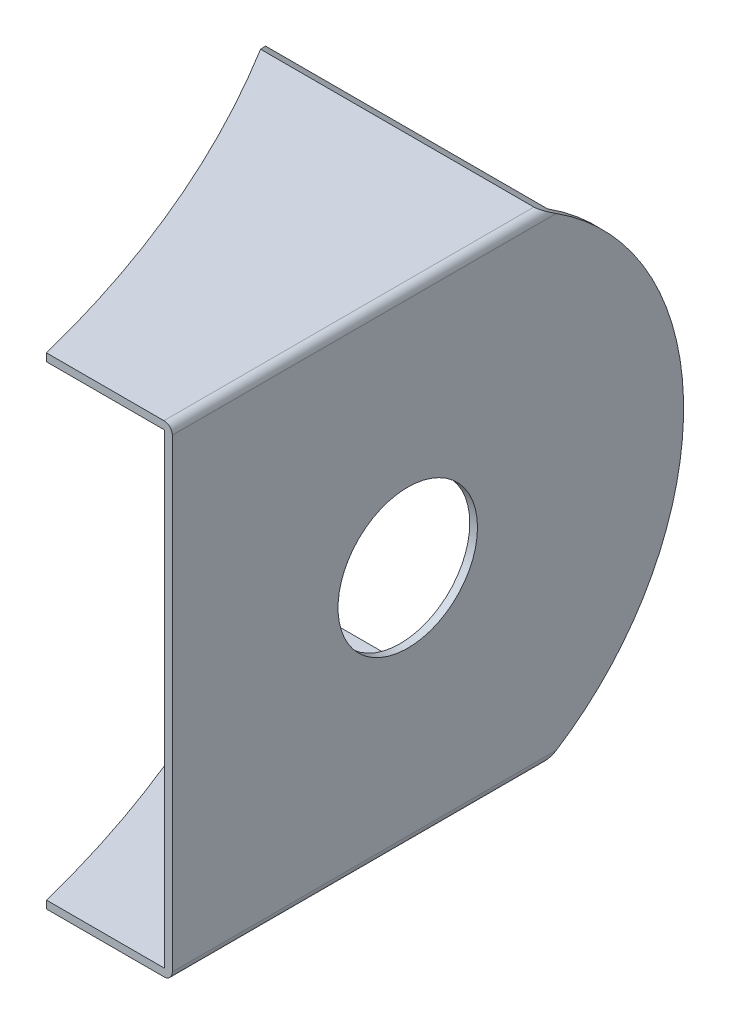
ISO-10303-21;
HEADER;
FILE_DESCRIPTION(('STEP AP214'),'2;1');
FILE_NAME('part.step','',(''),(''),'','','');
FILE_SCHEMA(('AUTOMOTIVE_DESIGN { 1 0 10303 214 1 1 1 1 }'));
ENDSEC;
DATA;
#1=APPLICATION_CONTEXT('core data for automotive mechanical design processes');
#2=APPLICATION_PROTOCOL_DEFINITION('international standard','automotive_design',2000,#1);
#3=PRODUCT_CONTEXT('',#1,'mechanical');
#4=PRODUCT('Part','Part','',(#3));
#5=PRODUCT_RELATED_PRODUCT_CATEGORY('part','',(#4));
#6=PRODUCT_DEFINITION_FORMATION('','',#4);
#7=PRODUCT_DEFINITION_CONTEXT('part definition',#1,'design');
#8=PRODUCT_DEFINITION('design','',#6,#7);
#9=PRODUCT_DEFINITION_SHAPE('','',#8);
#10=(LENGTH_UNIT() NAMED_UNIT(*) SI_UNIT(.MILLI.,.METRE.));
#11=(NAMED_UNIT(*) PLANE_ANGLE_UNIT() SI_UNIT($,.RADIAN.));
#12=(NAMED_UNIT(*) SI_UNIT($,.STERADIAN.) SOLID_ANGLE_UNIT());
#13=UNCERTAINTY_MEASURE_WITH_UNIT(LENGTH_MEASURE(1.E-05),#10,'distance_accuracy_value','');
#14=(GEOMETRIC_REPRESENTATION_CONTEXT(3) GLOBAL_UNCERTAINTY_ASSIGNED_CONTEXT((#13)) GLOBAL_UNIT_ASSIGNED_CONTEXT((#10,
#11,#12)) REPRESENTATION_CONTEXT('',''));
#15=CARTESIAN_POINT('',(0.,0.,0.));
#16=DIRECTION('',(0.,0.,1.));
#17=DIRECTION('',(1.,0.,0.));
#18=AXIS2_PLACEMENT_3D('',#15,#16,#17);
#19=CARTESIAN_POINT('',(-2.5,0.,0.));
#20=DIRECTION('',(-1.,0.,0.));
#21=DIRECTION('',(0.,0.,1.));
#22=AXIS2_PLACEMENT_3D('',#19,#20,#21);
#23=PLANE('',#22);
#24=CARTESIAN_POINT('',(-2.5,0.,-265.));
#25=DIRECTION('',(-1.,0.,0.));
#26=DIRECTION('',(0.,0.,1.));
#27=AXIS2_PLACEMENT_3D('',#24,#25,#26);
#28=CIRCLE('',#27,22.5);
#29=CARTESIAN_POINT('',(-2.5,0.,-242.5));
#30=VERTEX_POINT('',#29);
#31=EDGE_CURVE('E223',#30,#30,#28,.T.);
#32=ORIENTED_EDGE('',*,*,#31,.F.);
#33=EDGE_LOOP('',(#32));
#34=FACE_BOUND('',#33,.T.);
#35=CARTESIAN_POINT('',(-2.5,0.,-265.));
#36=DIRECTION('',(-1.,0.,0.));
#37=DIRECTION('',(0.,0.,1.));
#38=AXIS2_PLACEMENT_3D('',#35,#36,#37);
#39=CIRCLE('',#38,89.);
#40=CARTESIAN_POINT('',(-2.5,-75.,-312.916594202844));
#41=VERTEX_POINT('',#40);
#42=CARTESIAN_POINT('',(-2.49999999999999,75.,-312.916594202844));
#43=VERTEX_POINT('',#42);
#44=EDGE_CURVE('E295',#41,#43,#39,.F.);
#45=ORIENTED_EDGE('',*,*,#44,.F.);
#46=DIRECTION('',(0.,0.,-1.));
#47=VECTOR('',#46,1.);
#48=CARTESIAN_POINT('',(-2.5,-75.,365.));
#49=LINE('',#48,#47);
#50=CARTESIAN_POINT('',(-2.5,-75.,-189.039471801476));
#51=VERTEX_POINT('',#50);
#52=EDGE_CURVE('E176',#51,#41,#49,.T.);
#53=ORIENTED_EDGE('',*,*,#52,.F.);
#54=DIRECTION('',(0.,-1.,0.));
#55=VECTOR('',#54,1.);
#56=CARTESIAN_POINT('',(-2.5,0.,-189.039471801476));
#57=LINE('',#56,#55);
#58=CARTESIAN_POINT('',(-2.49999999999999,75.,-189.039471801476));
#59=VERTEX_POINT('',#58);
#60=EDGE_CURVE('E209',#59,#51,#57,.T.);
#61=ORIENTED_EDGE('',*,*,#60,.F.);
#62=DIRECTION('',(0.,0.,1.));
#63=VECTOR('',#62,1.);
#64=CARTESIAN_POINT('',(-2.5,75.,365.));
#65=LINE('',#64,#63);
#66=EDGE_CURVE('E237',#43,#59,#65,.T.);
#67=ORIENTED_EDGE('',*,*,#66,.F.);
#68=EDGE_LOOP('',(#45,#53,#61,#67));
#69=FACE_BOUND('',#68,.T.);
#70=ADVANCED_FACE('F78',(#34,#69),#23,.T.);
#71=CARTESIAN_POINT('',(0.,0.,0.));
#72=DIRECTION('',(-1.,0.,0.));
#73=DIRECTION('',(0.,0.,1.));
#74=AXIS2_PLACEMENT_3D('',#71,#72,#73);
#75=PLANE('',#74);
#76=CARTESIAN_POINT('',(0.,0.,-265.));
#77=DIRECTION('',(1.,0.,0.));
#78=DIRECTION('',(0.,0.,-1.));
#79=AXIS2_PLACEMENT_3D('',#76,#77,#78);
#80=CIRCLE('',#79,22.5);
#81=CARTESIAN_POINT('',(0.,0.,-287.5));
#82=VERTEX_POINT('',#81);
#83=EDGE_CURVE('E220',#82,#82,#80,.T.);
#84=ORIENTED_EDGE('',*,*,#83,.F.);
#85=EDGE_LOOP('',(#84));
#86=FACE_BOUND('',#85,.T.);
#87=DIRECTION('',(0.,0.,-1.));
#88=VECTOR('',#87,1.);
#89=CARTESIAN_POINT('',(0.,-75.,365.));
#90=LINE('',#89,#88);
#91=CARTESIAN_POINT('',(0.,-75.,-189.039471801476));
#92=VERTEX_POINT('',#91);
#93=CARTESIAN_POINT('',(0.,-75.,-312.916594202844));
#94=VERTEX_POINT('',#93);
#95=EDGE_CURVE('E239',#92,#94,#90,.T.);
#96=ORIENTED_EDGE('',*,*,#95,.T.);
#97=CARTESIAN_POINT('',(0.,0.,-265.));
#98=DIRECTION('',(-1.,0.,0.));
#99=DIRECTION('',(0.,0.,1.));
#100=AXIS2_PLACEMENT_3D('',#97,#98,#99);
#101=CIRCLE('',#100,89.);
#102=CARTESIAN_POINT('',(0.,75.,-312.916594202844));
#103=VERTEX_POINT('',#102);
#104=EDGE_CURVE('E292',#94,#103,#101,.F.);
#105=ORIENTED_EDGE('',*,*,#104,.T.);
#106=DIRECTION('',(0.,0.,1.));
#107=VECTOR('',#106,1.);
#108=CARTESIAN_POINT('',(0.,75.,365.));
#109=LINE('',#108,#107);
#110=CARTESIAN_POINT('',(0.,75.,-189.039471801476));
#111=VERTEX_POINT('',#110);
#112=EDGE_CURVE('E234',#103,#111,#109,.T.);
#113=ORIENTED_EDGE('',*,*,#112,.T.);
#114=DIRECTION('',(0.,-1.,0.));
#115=VECTOR('',#114,1.);
#116=CARTESIAN_POINT('',(0.,0.,-189.039471801476));
#117=LINE('',#116,#115);
#118=EDGE_CURVE('E206',#111,#92,#117,.T.);
#119=ORIENTED_EDGE('',*,*,#118,.T.);
#120=EDGE_LOOP('',(#96,#105,#113,#119));
#121=FACE_BOUND('',#120,.T.);
#122=ADVANCED_FACE('F80',(#86,#121),#75,.F.);
#123=CARTESIAN_POINT('',(-2.69999999999999,75.,-365.));
#124=DIRECTION('',(0.,0.,-1.));
#125=DIRECTION('',(0.,1.,0.));
#126=AXIS2_PLACEMENT_3D('',#123,#124,#125);
#127=CYLINDRICAL_SURFACE('',#126,2.70000000000001);
#128=CARTESIAN_POINT('',(-2.69999999999997,77.7,-308.401728076195));
#129=CARTESIAN_POINT('',(-2.65984174106867,77.7000054761132,-308.401717883849));
#130=CARTESIAN_POINT('',(-2.61970528145279,77.6991034412853,-308.403333172818));
#131=CARTESIAN_POINT('',(-2.53980520822541,77.6955387905893,-308.409714035789));
#132=CARTESIAN_POINT('',(-2.50004123564935,77.6928780963616,-308.414476171313));
#133=CARTESIAN_POINT('',(-2.38257877020893,77.6824174794397,-308.433192660789));
#134=CARTESIAN_POINT('',(-2.30577201693634,77.6721362371867,-308.451582221636));
#135=CARTESIAN_POINT('',(-2.13840998950567,77.6426315917734,-308.504285477607));
#136=CARTESIAN_POINT('',(-2.04902879567054,77.6218457699447,-308.541376779199));
#137=CARTESIAN_POINT('',(-1.87803547909732,77.5733886538341,-308.627649900219));
#138=CARTESIAN_POINT('',(-1.79646143216918,77.5456857783308,-308.676887161744));
#139=CARTESIAN_POINT('',(-1.59701187561457,77.4679108816823,-308.814746794419));
#140=CARTESIAN_POINT('',(-1.48508364540553,77.4141112449714,-308.9097812655));
#141=CARTESIAN_POINT('',(-1.27860490111387,77.298622782817,-309.112772265397));
#142=CARTESIAN_POINT('',(-1.18409022644408,77.2369181204061,-309.220754705645));
#143=CARTESIAN_POINT('',(-1.01593601718422,77.1128214081418,-309.436777347634));
#144=CARTESIAN_POINT('',(-0.941283618400156,77.0507984876956,-309.544253999978));
#145=CARTESIAN_POINT('',(-0.802703646058977,76.9233141028206,-309.764047137146));
#146=CARTESIAN_POINT('',(-0.738785133111477,76.8578497940605,-309.876367611201));
#147=CARTESIAN_POINT('',(-0.620156558505706,76.7240279015436,-310.104779546486));
#148=CARTESIAN_POINT('',(-0.565483953343053,76.6556598897692,-310.220884176106));
#149=CARTESIAN_POINT('',(-0.464656302995636,76.5167722720493,-310.455496572402));
#150=CARTESIAN_POINT('',(-0.418503814466663,76.4462520276506,-310.574005048607));
#151=CARTESIAN_POINT('',(-0.311470271773239,76.2653583754462,-310.87636130187));
#152=CARTESIAN_POINT('',(-0.255853419959808,76.153780447872,-311.061362462463));
#153=CARTESIAN_POINT('',(-0.161279447431643,75.9273334662262,-311.433690328185));
#154=CARTESIAN_POINT('',(-0.122333637112966,75.8124622340254,-311.621018523692));
#155=CARTESIAN_POINT('',(-0.0608930546610915,75.5822711688357,-311.99326839316));
#156=CARTESIAN_POINT('',(-0.0381096888427271,75.4669981949599,-312.178171199399));
#157=CARTESIAN_POINT('',(-0.0152806223880766,75.2927502461648,-312.455386101439));
#158=CARTESIAN_POINT('',(-0.00956196895024056,75.2344821123025,-312.547708999313));
#159=CARTESIAN_POINT('',(-0.00192392878167001,75.1175346055043,-312.732252529271));
#160=CARTESIAN_POINT('',(-4.57947227604466E-06,75.0588552285237,-312.82447316034));
#161=CARTESIAN_POINT('',(0.,75.,-312.916594202844));
#162=B_SPLINE_CURVE_WITH_KNOTS('',3,(#128,#129,#130,#131,#132,#133,#134,#135,#136,#137,#138,
#139,#140,#141,#142,#143,#144,#145,#146,#147,#148,#149,#150,#151,#152,#153,#154,#155,#156,#157,
#158,#159,#160,#161),.UNSPECIFIED.,.F.,.F.,(4,2,2,2,2,2,2,2,2,2,2,2,2,2,2,2,4),(0.,
0.120392027188317,0.240652722191142,0.478401767589207,0.773717648538598,1.07040733153267,
1.53691788742703,2.00437811250791,2.43819289647317,2.8723720481409,3.30827004349675,
3.74429862815162,4.41276982819331,5.08169383358021,5.73835060599414,6.0662608880654,
6.39417439988109),.UNSPECIFIED.);
#163=CARTESIAN_POINT('',(-2.69999999999998,77.7000000000004,-308.401728076195));
#164=VERTEX_POINT('',#163);
#165=EDGE_CURVE('E284',#164,#103,#162,.T.);
#166=ORIENTED_EDGE('',*,*,#165,.F.);
#167=DIRECTION('',(0.,0.,-1.));
#168=VECTOR('',#167,1.);
#169=CARTESIAN_POINT('',(-2.69999999999999,77.7,0.));
#170=LINE('',#169,#168);
#171=CARTESIAN_POINT('',(-2.69999999999997,77.7,-189.039471801476));
#172=VERTEX_POINT('',#171);
#173=EDGE_CURVE('E231',#172,#164,#170,.T.);
#174=ORIENTED_EDGE('',*,*,#173,.F.);
#175=CARTESIAN_POINT('',(-2.69999999999999,75.,-189.039471801476));
#176=DIRECTION('',(0.,0.,-1.));
#177=DIRECTION('',(-1.,0.,0.));
#178=AXIS2_PLACEMENT_3D('',#175,#176,#177);
#179=CIRCLE('',#178,2.70000000000001);
#180=EDGE_CURVE('E204',#111,#172,#179,.F.);
#181=ORIENTED_EDGE('',*,*,#180,.F.);
#182=ORIENTED_EDGE('',*,*,#112,.F.);
#183=EDGE_LOOP('',(#166,#174,#181,#182));
#184=FACE_BOUND('',#183,.T.);
#185=ADVANCED_FACE('F262',(#184),#127,.T.);
#186=CARTESIAN_POINT('',(-2.69999999999999,75.,-365.));
#187=DIRECTION('',(0.,0.,-1.));
#188=DIRECTION('',(0.,1.,0.));
#189=AXIS2_PLACEMENT_3D('',#186,#187,#188);
#190=CYLINDRICAL_SURFACE('',#189,0.200000000000006);
#191=DIRECTION('',(0.,0.,1.));
#192=VECTOR('',#191,1.);
#193=CARTESIAN_POINT('',(-2.70000000000001,75.2,365.));
#194=LINE('',#193,#192);
#195=CARTESIAN_POINT('',(-2.69999999999999,75.2,-189.039471801476));
#196=VERTEX_POINT('',#195);
#197=CARTESIAN_POINT('',(-2.70000000000001,75.2000000000004,-312.602100793977));
#198=VERTEX_POINT('',#197);
#199=EDGE_CURVE('E229',#196,#198,#194,.F.);
#200=ORIENTED_EDGE('',*,*,#199,.T.);
#201=CARTESIAN_POINT('',(-2.69999999999999,75.2,-312.602100793978));
#202=CARTESIAN_POINT('',(-2.69356074440797,75.2000081597546,-312.602087868224));
#203=CARTESIAN_POINT('',(-2.68714055642431,75.1996894485544,-312.602591392653));
#204=CARTESIAN_POINT('',(-2.67455867211747,75.1984726704153,-312.604513548254));
#205=CARTESIAN_POINT('',(-2.66839503066849,75.1975804389451,-312.605922962146));
#206=CARTESIAN_POINT('',(-2.65507803315628,75.1950333782778,-312.60994603715));
#207=CARTESIAN_POINT('',(-2.64800964799402,75.1932530330245,-312.61275788283));
#208=CARTESIAN_POINT('',(-2.63449025806675,75.1890998537107,-312.619316232223));
#209=CARTESIAN_POINT('',(-2.62804191392264,75.1867246113549,-312.623066534994));
#210=CARTESIAN_POINT('',(-2.61271343341617,75.180225706199,-312.633325679449));
#211=CARTESIAN_POINT('',(-2.60424696089279,75.1758243962924,-312.640271859968));
#212=CARTESIAN_POINT('',(-2.58865954876164,75.1663923286703,-312.65515232309));
#213=CARTESIAN_POINT('',(-2.58154112879144,75.1613604209051,-312.663088410904));
#214=CARTESIAN_POINT('',(-2.56358560665339,75.1469889522152,-312.685745663265));
#215=CARTESIAN_POINT('',(-2.55392106470705,75.1372293574547,-312.701122776083));
#216=CARTESIAN_POINT('',(-2.53729377265146,75.1170376674919,-312.732913295105));
#217=CARTESIAN_POINT('',(-2.53034477498696,75.1066024533928,-312.749331498938));
#218=CARTESIAN_POINT('',(-2.52025623972902,75.088155668948,-312.778332866958));
#219=CARTESIAN_POINT('',(-2.51659556886052,75.0802265551514,-312.790792020566));
#220=CARTESIAN_POINT('',(-2.51040050699822,75.0642313029192,-312.815911585961));
#221=CARTESIAN_POINT('',(-2.50786689376081,75.0561650738365,-312.828572130503));
#222=CARTESIAN_POINT('',(-2.50388851599764,75.040095804099,-312.853779797852));
#223=CARTESIAN_POINT('',(-2.50242523105904,75.0320941813387,-312.86632494786));
#224=CARTESIAN_POINT('',(-2.50048416425696,75.0160623709561,-312.891446095826));
#225=CARTESIAN_POINT('',(-2.50000485825316,75.00803224684,-312.904022015821));
#226=CARTESIAN_POINT('',(-2.49999999999999,75.,-312.916594202844));
#227=B_SPLINE_CURVE_WITH_KNOTS('',3,(#201,#202,#203,#204,#205,#206,#207,#208,#209,#210,#211,
#212,#213,#214,#215,#216,#217,#218,#219,#220,#221,#222,#223,#224,#225,#226),.UNSPECIFIED.,.F.,
.F.,(4,2,2,2,2,2,2,2,2,2,2,2,4),(0.,0.0192593530396677,0.0383257824187712,0.0616349667844509,
0.0850400825910045,0.120248878276495,0.155522846677881,0.217035299640851,0.278855356017721,
0.324455511713961,0.370087086392449,0.414909084578551,0.459661602905175),.UNSPECIFIED.);
#228=EDGE_CURVE('E276',#198,#43,#227,.T.);
#229=ORIENTED_EDGE('',*,*,#228,.T.);
#230=ORIENTED_EDGE('',*,*,#66,.T.);
#231=CARTESIAN_POINT('',(-2.69999999999999,75.,-189.039471801476));
#232=DIRECTION('',(0.,0.,-1.));
#233=DIRECTION('',(-1.,0.,0.));
#234=AXIS2_PLACEMENT_3D('',#231,#232,#233);
#235=CIRCLE('',#234,0.200000000000006);
#236=EDGE_CURVE('E201',#59,#196,#235,.F.);
#237=ORIENTED_EDGE('',*,*,#236,.T.);
#238=EDGE_LOOP('',(#200,#229,#230,#237));
#239=FACE_BOUND('',#238,.T.);
#240=ADVANCED_FACE('F267',(#239),#190,.F.);
#241=CARTESIAN_POINT('',(2.69957650317733E-13,77.7,0.));
#242=DIRECTION('',(0.,1.,0.));
#243=DIRECTION('',(-1.,0.,0.));
#244=AXIS2_PLACEMENT_3D('',#241,#242,#243);
#245=PLANE('',#244);
#246=CARTESIAN_POINT('',(-454.199150516691,77.7000000000004,-84.9999999999941));
#247=DIRECTION('',(0.,-1.,0.));
#248=DIRECTION('',(1.,0.,0.));
#249=AXIS2_PLACEMENT_3D('',#246,#247,#248);
#250=CIRCLE('',#249,426.5);
#251=CARTESIAN_POINT('',(-90.8894783462841,77.7000000000004,-308.401728076195));
#252=VERTEX_POINT('',#251);
#253=CARTESIAN_POINT('',(-40.5833404860915,77.7000000000018,-189.039471801476));
#254=VERTEX_POINT('',#253);
#255=EDGE_CURVE('E99',#252,#254,#250,.T.);
#256=ORIENTED_EDGE('',*,*,#255,.T.);
#257=DIRECTION('',(-1.,0.,0.));
#258=VECTOR('',#257,1.);
#259=CARTESIAN_POINT('',(2.69957650317733E-13,77.7,-189.039471801476));
#260=LINE('',#259,#258);
#261=EDGE_CURVE('E194',#172,#254,#260,.T.);
#262=ORIENTED_EDGE('',*,*,#261,.F.);
#263=ORIENTED_EDGE('',*,*,#173,.T.);
#264=DIRECTION('',(1.,0.,0.));
#265=VECTOR('',#264,1.);
#266=CARTESIAN_POINT('',(-130.,77.7000000000004,-308.401728076195));
#267=LINE('',#266,#265);
#268=EDGE_CURVE('E285',#252,#164,#267,.T.);
#269=ORIENTED_EDGE('',*,*,#268,.F.);
#270=EDGE_LOOP('',(#256,#262,#263,#269));
#271=FACE_BOUND('',#270,.T.);
#272=ADVANCED_FACE('F271',(#271),#245,.T.);
#273=CARTESIAN_POINT('',(2.61228946970625E-13,75.2,0.));
#274=DIRECTION('',(0.,1.,0.));
#275=DIRECTION('',(-1.,0.,0.));
#276=AXIS2_PLACEMENT_3D('',#273,#274,#275);
#277=PLANE('',#276);
#278=DIRECTION('',(-1.,0.,0.));
#279=VECTOR('',#278,1.);
#280=CARTESIAN_POINT('',(2.61228946970625E-13,75.2,-189.039471801476));
#281=LINE('',#280,#279);
#282=CARTESIAN_POINT('',(-40.5833404860915,75.2000000000001,-189.039471801476));
#283=VERTEX_POINT('',#282);
#284=EDGE_CURVE('E190',#196,#283,#281,.T.);
#285=ORIENTED_EDGE('',*,*,#284,.T.);
#286=CARTESIAN_POINT('',(-454.199150516691,75.2000000000016,-84.9999999999941));
#287=DIRECTION('',(0.,1.,0.));
#288=DIRECTION('',(-1.,0.,0.));
#289=AXIS2_PLACEMENT_3D('',#286,#287,#288);
#290=CIRCLE('',#289,426.5);
#291=CARTESIAN_POINT('',(-93.5060209533931,75.2000000000004,-312.602100793977));
#292=VERTEX_POINT('',#291);
#293=EDGE_CURVE('E328',#283,#292,#290,.T.);
#294=ORIENTED_EDGE('',*,*,#293,.T.);
#295=DIRECTION('',(1.,0.,0.));
#296=VECTOR('',#295,1.);
#297=CARTESIAN_POINT('',(-130.,75.2000000000004,-312.602100793977));
#298=LINE('',#297,#296);
#299=EDGE_CURVE('E349',#292,#198,#298,.T.);
#300=ORIENTED_EDGE('',*,*,#299,.T.);
#301=ORIENTED_EDGE('',*,*,#199,.F.);
#302=EDGE_LOOP('',(#285,#294,#300,#301));
#303=FACE_BOUND('',#302,.T.);
#304=ADVANCED_FACE('F318',(#303),#277,.F.);
#305=CARTESIAN_POINT('',(-2.70000000000002,-75.,365.));
#306=DIRECTION('',(0.,0.,1.));
#307=DIRECTION('',(0.,-1.,0.));
#308=AXIS2_PLACEMENT_3D('',#305,#306,#307);
#309=CYLINDRICAL_SURFACE('',#308,2.70000000000001);
#310=CARTESIAN_POINT('',(0.,-75.,-312.916594202844));
#311=CARTESIAN_POINT('',(-5.48315406733443E-06,-75.0615534313284,-312.820249925329));
#312=CARTESIAN_POINT('',(-0.00210431795436465,-75.122913952728,-312.723797557342));
#313=CARTESIAN_POINT('',(-0.0104562440630518,-75.2451842713042,-312.530782576569));
#314=CARTESIAN_POINT('',(-0.0167094666221996,-75.3060940541792,-312.434219960396));
#315=CARTESIAN_POINT('',(-0.0416787173237319,-75.488240162083,-312.144222668999));
#316=CARTESIAN_POINT('',(-0.0666041220879811,-75.6086938358383,-311.950790694987));
#317=CARTESIAN_POINT('',(-0.133105592482795,-75.8462911155908,-311.565986057194));
#318=CARTESIAN_POINT('',(-0.174607486245809,-75.9634470106966,-311.374608068388));
#319=CARTESIAN_POINT('',(-0.275186663854188,-76.1942049589935,-310.994482796744));
#320=CARTESIAN_POINT('',(-0.334247367463908,-76.307810253563,-310.805733207225));
#321=CARTESIAN_POINT('',(-0.430480944116539,-76.4635568188196,-310.544835238964));
#322=CARTESIAN_POINT('',(-0.459480841092596,-76.507620544854,-310.470774343927));
#323=CARTESIAN_POINT('',(-0.520769433258584,-76.5949287880894,-310.323550301138));
#324=CARTESIAN_POINT('',(-0.553057851111653,-76.6381733740083,-310.250387078262));
#325=CARTESIAN_POINT('',(-0.655437985567025,-76.7668763192897,-310.031935992275));
#326=CARTESIAN_POINT('',(-0.730844021815753,-76.8509727575857,-309.888241659646));
#327=CARTESIAN_POINT('',(-0.866564745573287,-76.9833798717041,-309.660603317542));
#328=CARTESIAN_POINT('',(-0.92185820430153,-77.033233679171,-309.574548753646));
#329=CARTESIAN_POINT('',(-1.03968524628489,-77.1305406389732,-309.405958594687));
#330=CARTESIAN_POINT('',(-1.10222325104569,-77.1779922995707,-309.323425191153));
#331=CARTESIAN_POINT('',(-1.23510674144134,-77.269484805367,-309.163731030463));
#332=CARTESIAN_POINT('',(-1.3054069686753,-77.3135431191499,-309.086542997064));
#333=CARTESIAN_POINT('',(-1.45511835627923,-77.3974199950886,-308.939123103068));
#334=CARTESIAN_POINT('',(-1.53451386478099,-77.437245620045,-308.868879668609));
#335=CARTESIAN_POINT('',(-1.68909308922567,-77.5047750414191,-308.749442574968));
#336=CARTESIAN_POINT('',(-1.76266730069061,-77.5333865948939,-308.698704452017));
#337=CARTESIAN_POINT('',(-1.91724564234332,-77.5853340005456,-308.606407201778));
#338=CARTESIAN_POINT('',(-1.9982528637253,-77.6086676436716,-308.564851918102));
#339=CARTESIAN_POINT('',(-2.16853832368213,-77.6486316631693,-308.493582556169));
#340=CARTESIAN_POINT('',(-2.25791694027921,-77.665163054478,-308.464043400064));
#341=CARTESIAN_POINT('',(-2.39546994532592,-77.6831717589383,-308.43184279697));
#342=CARTESIAN_POINT('',(-2.44184168031941,-77.6880413985335,-308.423130643608));
#343=CARTESIAN_POINT('',(-2.53536496341074,-77.6953818428264,-308.409995418962));
#344=CARTESIAN_POINT('',(-2.58251587744709,-77.6978545089019,-308.405569019563));
#345=CARTESIAN_POINT('',(-2.65317358667668,-77.6996966159089,-308.402271161887));
#346=CARTESIAN_POINT('',(-2.67658943419555,-77.7000027594894,-308.40172300444));
#347=CARTESIAN_POINT('',(-2.70000000000001,-77.7,-308.401728076195));
#348=B_SPLINE_CURVE_WITH_KNOTS('',3,(#310,#311,#312,#313,#314,#315,#316,#317,#318,#319,#320,
#321,#322,#323,#324,#325,#326,#327,#328,#329,#330,#331,#332,#333,#334,#335,#336,#337,#338,#339,
#340,#341,#342,#343,#344,#345,#346,#347),.UNSPECIFIED.,.F.,.F.,(4,2,2,2,2,2,2,2,2,2,2,2,2,2,2,2,
2,2,4),(0.,0.342941922447976,0.685894680073237,1.37290877849785,2.05688265066433,
2.74021270797353,3.01293409410221,3.28563249933316,3.83305397194942,4.1741856198769,
4.51552657588798,4.85497306730471,5.19384394777077,5.47464815793366,5.75556968112398,
6.04044571129364,6.18252906909512,6.32450200298501,6.39473975055717),.UNSPECIFIED.);
#349=CARTESIAN_POINT('',(-2.70000000000001,-77.7,-308.401728076195));
#350=VERTEX_POINT('',#349);
#351=EDGE_CURVE('E188',#94,#350,#348,.T.);
#352=ORIENTED_EDGE('',*,*,#351,.F.);
#353=ORIENTED_EDGE('',*,*,#95,.F.);
#354=CARTESIAN_POINT('',(-2.70000000000002,-75.,-189.039471801476));
#355=DIRECTION('',(0.,0.,-1.));
#356=DIRECTION('',(-1.,0.,0.));
#357=AXIS2_PLACEMENT_3D('',#354,#355,#356);
#358=CIRCLE('',#357,2.70000000000001);
#359=CARTESIAN_POINT('',(-2.70000000000002,-77.7,-189.039471801476));
#360=VERTEX_POINT('',#359);
#361=EDGE_CURVE('E214',#360,#92,#358,.F.);
#362=ORIENTED_EDGE('',*,*,#361,.F.);
#363=DIRECTION('',(0.,0.,1.));
#364=VECTOR('',#363,1.);
#365=CARTESIAN_POINT('',(-2.7,-77.7,-365.));
#366=LINE('',#365,#364);
#367=EDGE_CURVE('E227',#360,#350,#366,.F.);
#368=ORIENTED_EDGE('',*,*,#367,.T.);
#369=EDGE_LOOP('',(#352,#353,#362,#368));
#370=FACE_BOUND('',#369,.T.);
#371=ADVANCED_FACE('F313',(#370),#309,.T.);
#372=CARTESIAN_POINT('',(-2.70000000000002,-75.,365.));
#373=DIRECTION('',(0.,0.,1.));
#374=DIRECTION('',(0.,-1.,0.));
#375=AXIS2_PLACEMENT_3D('',#372,#373,#374);
#376=CYLINDRICAL_SURFACE('',#375,0.200000000000006);
#377=ORIENTED_EDGE('',*,*,#52,.T.);
#378=CARTESIAN_POINT('',(-2.50000000000002,-75.,-312.916594202844));
#379=CARTESIAN_POINT('',(-2.50000814912922,-75.0090840001549,-312.902375823492));
#380=CARTESIAN_POINT('',(-2.50061950746852,-75.0181663468577,-312.888150968514));
#381=CARTESIAN_POINT('',(-2.50310586748239,-75.0362985743765,-312.859734424288));
#382=CARTESIAN_POINT('',(-2.50498448774922,-75.0453482874082,-312.84554294712));
#383=CARTESIAN_POINT('',(-2.51007460955225,-75.0633738417529,-312.81725829119));
#384=CARTESIAN_POINT('',(-2.51329207384104,-75.0723491670526,-312.803165842635));
#385=CARTESIAN_POINT('',(-2.52117927184258,-75.0900971410082,-312.775282140062));
#386=CARTESIAN_POINT('',(-2.52584695948389,-75.0988700566201,-312.761490490813));
#387=CARTESIAN_POINT('',(-2.53547249033267,-75.1139724922818,-312.737734370018));
#388=CARTESIAN_POINT('',(-2.54007224556964,-75.1203691015468,-312.727667899897));
#389=CARTESIAN_POINT('',(-2.55033486852539,-75.1329138331611,-312.707917535215));
#390=CARTESIAN_POINT('',(-2.55599788639378,-75.1390619202658,-312.698233694922));
#391=CARTESIAN_POINT('',(-2.56860406291956,-75.1510344785914,-312.679368101461));
#392=CARTESIAN_POINT('',(-2.57555693181496,-75.1568560270035,-312.670190891967));
#393=CARTESIAN_POINT('',(-2.59093439630727,-75.1679111215306,-312.652756931437));
#394=CARTESIAN_POINT('',(-2.59935534585359,-75.1731460727819,-312.644497981187));
#395=CARTESIAN_POINT('',(-2.61412385041696,-75.1807299251493,-312.632529600968));
#396=CARTESIAN_POINT('',(-2.61991956374032,-75.18338605653,-312.628336962936));
#397=CARTESIAN_POINT('',(-2.63214561638514,-75.1882525977177,-312.620654047139));
#398=CARTESIAN_POINT('',(-2.63857612406581,-75.190462888804,-312.617163956453));
#399=CARTESIAN_POINT('',(-2.65212699644402,-75.1943152286945,-312.611080333546));
#400=CARTESIAN_POINT('',(-2.65925534298858,-75.1959493961739,-312.60849923676));
#401=CARTESIAN_POINT('',(-2.67396606121457,-75.1984369927653,-312.604569943383));
#402=CARTESIAN_POINT('',(-2.68154657875856,-75.1992934042232,-312.603217037237));
#403=CARTESIAN_POINT('',(-2.69099093581041,-75.1998052488306,-312.602408453007));
#404=CARTESIAN_POINT('',(-2.69279034541177,-75.1998782112942,-312.602293190549));
#405=CARTESIAN_POINT('',(-2.69639289368694,-75.1999755091003,-312.602139484008));
#406=CARTESIAN_POINT('',(-2.69819603016305,-75.1999998677061,-312.602101003174));
#407=CARTESIAN_POINT('',(-2.70000000000002,-75.2,-312.602100793978));
#408=B_SPLINE_CURVE_WITH_KNOTS('',3,(#378,#379,#380,#381,#382,#383,#384,#385,#386,#387,#388,
#389,#390,#391,#392,#393,#394,#395,#396,#397,#398,#399,#400,#401,#402,#403,#404,#405,#406,#407),
.UNSPECIFIED.,.F.,.F.,(4,2,2,2,2,2,2,2,2,2,2,2,2,2,4),(0.,0.0506140218710687,0.101373184347036,
0.152360872170664,0.203276947361266,0.241584454468244,0.279897375279042,0.318511377440862,
0.357030811568396,0.379866462112315,0.40270818544925,0.425851252046133,0.448905195974393,
0.454317464326197,0.459727141578067),.UNSPECIFIED.);
#409=CARTESIAN_POINT('',(-2.70000000000002,-75.2,-312.602100793978));
#410=VERTEX_POINT('',#409);
#411=EDGE_CURVE('E297',#41,#410,#408,.T.);
#412=ORIENTED_EDGE('',*,*,#411,.T.);
#413=DIRECTION('',(0.,0.,1.));
#414=VECTOR('',#413,1.);
#415=CARTESIAN_POINT('',(-2.70000000000001,-75.2,-365.));
#416=LINE('',#415,#414);
#417=CARTESIAN_POINT('',(-2.70000000000002,-75.2,-189.039471801476));
#418=VERTEX_POINT('',#417);
#419=EDGE_CURVE('E226',#410,#418,#416,.T.);
#420=ORIENTED_EDGE('',*,*,#419,.T.);
#421=CARTESIAN_POINT('',(-2.70000000000002,-75.,-189.039471801476));
#422=DIRECTION('',(0.,0.,-1.));
#423=DIRECTION('',(-1.,0.,0.));
#424=AXIS2_PLACEMENT_3D('',#421,#422,#423);
#425=CIRCLE('',#424,0.200000000000006);
#426=EDGE_CURVE('E211',#418,#51,#425,.F.);
#427=ORIENTED_EDGE('',*,*,#426,.T.);
#428=EDGE_LOOP('',(#377,#412,#420,#427));
#429=FACE_BOUND('',#428,.T.);
#430=ADVANCED_FACE('F309',(#429),#376,.F.);
#431=CARTESIAN_POINT('',(2.69957650317733E-13,-77.7,0.));
#432=DIRECTION('',(0.,1.,0.));
#433=DIRECTION('',(-1.,0.,0.));
#434=AXIS2_PLACEMENT_3D('',#431,#432,#433);
#435=PLANE('',#434);
#436=DIRECTION('',(-1.,0.,0.));
#437=VECTOR('',#436,1.);
#438=CARTESIAN_POINT('',(2.69957650317733E-13,-77.7,-189.039471801476));
#439=LINE('',#438,#437);
#440=CARTESIAN_POINT('',(-40.5833404860909,-77.7000000000001,-189.039471801476));
#441=VERTEX_POINT('',#440);
#442=EDGE_CURVE('E183',#360,#441,#439,.T.);
#443=ORIENTED_EDGE('',*,*,#442,.T.);
#444=CARTESIAN_POINT('',(-454.19915051669,-77.7000000000016,-84.9999999999941));
#445=DIRECTION('',(0.,-1.,0.));
#446=DIRECTION('',(1.,0.,0.));
#447=AXIS2_PLACEMENT_3D('',#444,#445,#446);
#448=CIRCLE('',#447,426.5);
#449=CARTESIAN_POINT('',(-90.8894783462846,-77.7000000000016,-308.401728076195));
#450=VERTEX_POINT('',#449);
#451=EDGE_CURVE('E171',#450,#441,#448,.T.);
#452=ORIENTED_EDGE('',*,*,#451,.F.);
#453=DIRECTION('',(1.,0.,0.));
#454=VECTOR('',#453,1.);
#455=CARTESIAN_POINT('',(-130.,-77.7000000000004,-308.401728076195));
#456=LINE('',#455,#454);
#457=EDGE_CURVE('E181',#450,#350,#456,.T.);
#458=ORIENTED_EDGE('',*,*,#457,.T.);
#459=ORIENTED_EDGE('',*,*,#367,.F.);
#460=EDGE_LOOP('',(#443,#452,#458,#459));
#461=FACE_BOUND('',#460,.T.);
#462=ADVANCED_FACE('F179',(#461),#435,.F.);
#463=CARTESIAN_POINT('',(2.61228946970625E-13,-75.2,0.));
#464=DIRECTION('',(0.,1.,0.));
#465=DIRECTION('',(-1.,0.,0.));
#466=AXIS2_PLACEMENT_3D('',#463,#464,#465);
#467=PLANE('',#466);
#468=CARTESIAN_POINT('',(-454.19915051669,-75.2000000000016,-84.9999999999941));
#469=DIRECTION('',(0.,1.,0.));
#470=DIRECTION('',(-1.,0.,0.));
#471=AXIS2_PLACEMENT_3D('',#468,#469,#470);
#472=CIRCLE('',#471,426.5);
#473=CARTESIAN_POINT('',(-40.5833404860909,-75.2000000000001,-189.039471801476));
#474=VERTEX_POINT('',#473);
#475=CARTESIAN_POINT('',(-93.5060209533925,-75.2000000000004,-312.602100793977));
#476=VERTEX_POINT('',#475);
#477=EDGE_CURVE('E106',#474,#476,#472,.T.);
#478=ORIENTED_EDGE('',*,*,#477,.F.);
#479=DIRECTION('',(-1.,0.,0.));
#480=VECTOR('',#479,1.);
#481=CARTESIAN_POINT('',(2.61228946970625E-13,-75.2,-189.039471801476));
#482=LINE('',#481,#480);
#483=EDGE_CURVE('E216',#418,#474,#482,.T.);
#484=ORIENTED_EDGE('',*,*,#483,.F.);
#485=ORIENTED_EDGE('',*,*,#419,.F.);
#486=DIRECTION('',(1.,0.,0.));
#487=VECTOR('',#486,1.);
#488=CARTESIAN_POINT('',(-130.,-75.2000000000004,-312.602100793977));
#489=LINE('',#488,#487);
#490=EDGE_CURVE('E191',#476,#410,#489,.T.);
#491=ORIENTED_EDGE('',*,*,#490,.F.);
#492=EDGE_LOOP('',(#478,#484,#485,#491));
#493=FACE_BOUND('',#492,.T.);
#494=ADVANCED_FACE('F343',(#493),#467,.T.);
#495=CARTESIAN_POINT('',(-10.,0.,-265.));
#496=DIRECTION('',(1.,0.,0.));
#497=DIRECTION('',(0.,0.,-1.));
#498=AXIS2_PLACEMENT_3D('',#495,#496,#497);
#499=CYLINDRICAL_SURFACE('',#498,22.5);
#500=ORIENTED_EDGE('',*,*,#31,.T.);
#501=EDGE_LOOP('',(#500));
#502=FACE_BOUND('',#501,.T.);
#503=ORIENTED_EDGE('',*,*,#83,.T.);
#504=EDGE_LOOP('',(#503));
#505=FACE_BOUND('',#504,.T.);
#506=ADVANCED_FACE('F403',(#502,#505),#499,.F.);
#507=CARTESIAN_POINT('',(-130.,122.559083392823,-189.039471801476));
#508=DIRECTION('',(0.,0.,-1.));
#509=DIRECTION('',(-1.,0.,0.));
#510=AXIS2_PLACEMENT_3D('',#507,#508,#509);
#511=PLANE('',#510);
#512=ORIENTED_EDGE('',*,*,#261,.T.);
#513=DIRECTION('',(0.,-1.,0.));
#514=VECTOR('',#513,1.);
#515=CARTESIAN_POINT('',(-40.5833404860915,77.7000000000018,-189.039471801476));
#516=LINE('',#515,#514);
#517=EDGE_CURVE('E334',#254,#283,#516,.T.);
#518=ORIENTED_EDGE('',*,*,#517,.T.);
#519=ORIENTED_EDGE('',*,*,#284,.F.);
#520=ORIENTED_EDGE('',*,*,#236,.F.);
#521=ORIENTED_EDGE('',*,*,#60,.T.);
#522=ORIENTED_EDGE('',*,*,#426,.F.);
#523=ORIENTED_EDGE('',*,*,#483,.T.);
#524=EDGE_CURVE('E344',#474,#441,#516,.T.);
#525=ORIENTED_EDGE('',*,*,#524,.T.);
#526=ORIENTED_EDGE('',*,*,#442,.F.);
#527=ORIENTED_EDGE('',*,*,#361,.T.);
#528=ORIENTED_EDGE('',*,*,#118,.F.);
#529=ORIENTED_EDGE('',*,*,#180,.T.);
#530=EDGE_LOOP('',(#512,#518,#519,#520,#521,#522,#523,#525,#526,#527,#528,#529));
#531=FACE_BOUND('',#530,.T.);
#532=ADVANCED_FACE('F332',(#531),#511,.F.);
#533=CARTESIAN_POINT('',(-130.,0.,-265.));
#534=DIRECTION('',(1.,0.,0.));
#535=DIRECTION('',(0.,0.,-1.));
#536=AXIS2_PLACEMENT_3D('',#533,#534,#535);
#537=CYLINDRICAL_SURFACE('',#536,89.);
#538=ORIENTED_EDGE('',*,*,#299,.F.);
#539=CARTESIAN_POINT('',(-101.071645549101,66.4806883565258,-324.171936554776));
#540=CARTESIAN_POINT('',(-100.246614585125,67.5648219684001,-322.953854245496));
#541=CARTESIAN_POINT('',(-99.4129361798469,68.6125503889022,-321.709347038183));
#542=CARTESIAN_POINT('',(-97.734092100392,70.6318425843113,-319.173469641224));
#543=CARTESIAN_POINT('',(-96.8889581109246,71.6035799559249,-317.882216745352));
#544=CARTESIAN_POINT('',(-95.1890995568465,73.4726388458049,-315.253086319123));
#545=CARTESIAN_POINT('',(-94.3343751275231,74.3699614123065,-313.915209445906));
#546=CARTESIAN_POINT('',(-92.6167277876924,76.0911357509348,-311.192404604257));
#547=CARTESIAN_POINT('',(-91.7537902849187,76.9148090535525,-309.807373004372));
#548=CARTESIAN_POINT('',(-90.8894783462849,77.7000000000007,-308.401728076194));
#549=B_SPLINE_CURVE_WITH_KNOTS('',3,(#539,#540,#541,#542,#543,#544,#545,#546,#547,#548),
.UNSPECIFIED.,.F.,.F.,(4,2,2,2,4),(0.,5.48180262040246,10.9506925407635,16.4195054111771,
21.901230359875),.UNSPECIFIED.);
#550=EDGE_CURVE('E13',#292,#252,#549,.T.);
#551=ORIENTED_EDGE('',*,*,#550,.T.);
#552=ORIENTED_EDGE('',*,*,#268,.T.);
#553=ORIENTED_EDGE('',*,*,#165,.T.);
#554=ORIENTED_EDGE('',*,*,#104,.F.);
#555=ORIENTED_EDGE('',*,*,#351,.T.);
#556=ORIENTED_EDGE('',*,*,#457,.F.);
#557=CARTESIAN_POINT('',(-90.8894783462846,-77.7000000000005,-308.401728076195));
#558=CARTESIAN_POINT('',(-91.7537902849184,-76.9148090535522,-309.807373004372));
#559=CARTESIAN_POINT('',(-92.616727787692,-76.0911357509346,-311.192404604257));
#560=CARTESIAN_POINT('',(-94.3343751275227,-74.3699614123063,-313.915209445906));
#561=CARTESIAN_POINT('',(-95.1890995568461,-73.4726388458047,-315.253086319123));
#562=CARTESIAN_POINT('',(-96.8889581109242,-71.6035799559247,-317.882216745352));
#563=CARTESIAN_POINT('',(-97.7340921003917,-70.6318425843112,-319.173469641224));
#564=CARTESIAN_POINT('',(-99.4129361798465,-68.6125503889022,-321.709347038183));
#565=CARTESIAN_POINT('',(-100.246614585124,-67.5648219684001,-322.953854245496));
#566=CARTESIAN_POINT('',(-101.0716455491,-66.4806883565257,-324.171936554777));
#567=B_SPLINE_CURVE_WITH_KNOTS('',3,(#557,#558,#559,#560,#561,#562,#563,#564,#565,#566),
.UNSPECIFIED.,.F.,.F.,(4,2,2,2,4),(0.,5.48172494869773,10.9505378191112,16.419427739472,
21.9012303598744),.UNSPECIFIED.);
#568=EDGE_CURVE('E92',#450,#476,#567,.T.);
#569=ORIENTED_EDGE('',*,*,#568,.T.);
#570=ORIENTED_EDGE('',*,*,#490,.T.);
#571=ORIENTED_EDGE('',*,*,#411,.F.);
#572=ORIENTED_EDGE('',*,*,#44,.T.);
#573=ORIENTED_EDGE('',*,*,#228,.F.);
#574=EDGE_LOOP('',(#538,#551,#552,#553,#554,#555,#556,#569,#570,#571,#572,#573));
#575=FACE_BOUND('',#574,.T.);
#576=ADVANCED_FACE('F186',(#575),#537,.T.);
#577=CARTESIAN_POINT('',(-454.199150516691,77.7000000000004,-84.9999999999941));
#578=DIRECTION('',(0.,-1.,0.));
#579=DIRECTION('',(1.,0.,0.));
#580=AXIS2_PLACEMENT_3D('',#577,#578,#579);
#581=CYLINDRICAL_SURFACE('',#580,426.5);
#582=ORIENTED_EDGE('',*,*,#477,.T.);
#583=ORIENTED_EDGE('',*,*,#568,.F.);
#584=ORIENTED_EDGE('',*,*,#451,.T.);
#585=ORIENTED_EDGE('',*,*,#524,.F.);
#586=EDGE_LOOP('',(#582,#583,#584,#585));
#587=FACE_BOUND('',#586,.T.);
#588=ADVANCED_FACE('F170',(#587),#581,.F.);
#589=ORIENTED_EDGE('',*,*,#255,.F.);
#590=ORIENTED_EDGE('',*,*,#550,.F.);
#591=ORIENTED_EDGE('',*,*,#293,.F.);
#592=ORIENTED_EDGE('',*,*,#517,.F.);
#593=EDGE_LOOP('',(#589,#590,#591,#592));
#594=FACE_BOUND('',#593,.T.);
#595=ADVANCED_FACE('F250',(#594),#581,.F.);
#596=CLOSED_SHELL('',(#70,#122,#185,#240,#272,#304,#371,#430,#462,#494,#506,#532,#576,#588,#595));
#597=MANIFOLD_SOLID_BREP('B2',#596);
#598=ADVANCED_BREP_SHAPE_REPRESENTATION('',(#18,#597),#14);
#599=SHAPE_DEFINITION_REPRESENTATION(#9,#598);
ENDSEC;
END-ISO-10303-21;
